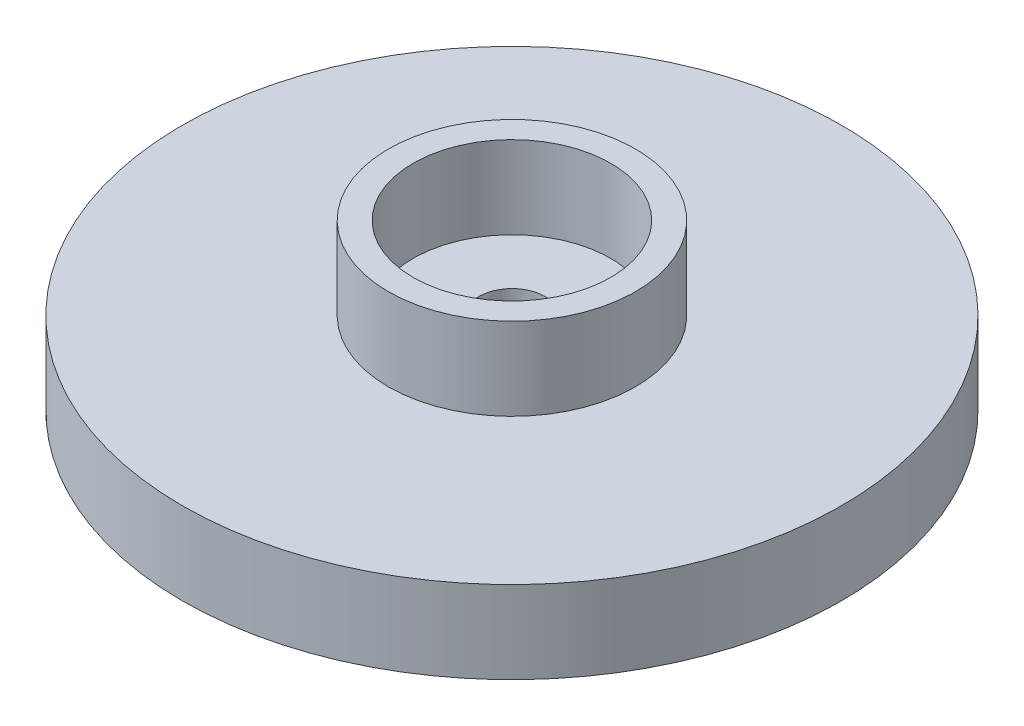
ISO-10303-21;
HEADER;
FILE_DESCRIPTION(('STEP AP214'),'2;1');
FILE_NAME('part.step','',(''),(''),'','','');
FILE_SCHEMA(('AUTOMOTIVE_DESIGN { 1 0 10303 214 1 1 1 1 }'));
ENDSEC;
DATA;
#1=APPLICATION_CONTEXT('core data for automotive mechanical design processes');
#2=APPLICATION_PROTOCOL_DEFINITION('international standard','automotive_design',2000,#1);
#3=PRODUCT_CONTEXT('',#1,'mechanical');
#4=PRODUCT('Part','Part','',(#3));
#5=PRODUCT_RELATED_PRODUCT_CATEGORY('part','',(#4));
#6=PRODUCT_DEFINITION_FORMATION('','',#4);
#7=PRODUCT_DEFINITION_CONTEXT('part definition',#1,'design');
#8=PRODUCT_DEFINITION('design','',#6,#7);
#9=PRODUCT_DEFINITION_SHAPE('','',#8);
#10=(LENGTH_UNIT() NAMED_UNIT(*) SI_UNIT(.MILLI.,.METRE.));
#11=(NAMED_UNIT(*) PLANE_ANGLE_UNIT() SI_UNIT($,.RADIAN.));
#12=(NAMED_UNIT(*) SI_UNIT($,.STERADIAN.) SOLID_ANGLE_UNIT());
#13=UNCERTAINTY_MEASURE_WITH_UNIT(LENGTH_MEASURE(1.E-05),#10,'distance_accuracy_value','');
#14=(GEOMETRIC_REPRESENTATION_CONTEXT(3) GLOBAL_UNCERTAINTY_ASSIGNED_CONTEXT((#13)) GLOBAL_UNIT_ASSIGNED_CONTEXT((#10,
#11,#12)) REPRESENTATION_CONTEXT('',''));
#15=CARTESIAN_POINT('',(0.,0.,0.));
#16=DIRECTION('',(0.,0.,1.));
#17=DIRECTION('',(1.,0.,0.));
#18=AXIS2_PLACEMENT_3D('',#15,#16,#17);
#19=CARTESIAN_POINT('',(0.,2.5,0.));
#20=DIRECTION('',(0.,-1.,0.));
#21=DIRECTION('',(0.,0.,-1.));
#22=AXIS2_PLACEMENT_3D('',#19,#20,#21);
#23=CYLINDRICAL_SURFACE('',#22,10.);
#24=CARTESIAN_POINT('',(0.,2.5,0.));
#25=DIRECTION('',(0.,1.,0.));
#26=DIRECTION('',(0.,0.,1.));
#27=AXIS2_PLACEMENT_3D('',#24,#25,#26);
#28=CIRCLE('',#27,10.);
#29=CARTESIAN_POINT('',(0.,2.5,10.));
#30=VERTEX_POINT('',#29);
#31=EDGE_CURVE('E50',#30,#30,#28,.T.);
#32=ORIENTED_EDGE('',*,*,#31,.F.);
#33=EDGE_LOOP('',(#32));
#34=FACE_BOUND('',#33,.T.);
#35=CARTESIAN_POINT('',(0.,0.,0.));
#36=DIRECTION('',(0.,1.,0.));
#37=DIRECTION('',(0.,0.,1.));
#38=AXIS2_PLACEMENT_3D('',#35,#36,#37);
#39=CIRCLE('',#38,10.);
#40=CARTESIAN_POINT('',(0.,0.,10.));
#41=VERTEX_POINT('',#40);
#42=EDGE_CURVE('E55',#41,#41,#39,.T.);
#43=ORIENTED_EDGE('',*,*,#42,.T.);
#44=EDGE_LOOP('',(#43));
#45=FACE_BOUND('',#44,.T.);
#46=ADVANCED_FACE('F43',(#34,#45),#23,.T.);
#47=CARTESIAN_POINT('',(0.,2.5,0.));
#48=DIRECTION('',(0.,1.,0.));
#49=DIRECTION('',(0.,0.,1.));
#50=AXIS2_PLACEMENT_3D('',#47,#48,#49);
#51=PLANE('',#50);
#52=CARTESIAN_POINT('',(0.,2.5,0.));
#53=DIRECTION('',(0.,1.,0.));
#54=DIRECTION('',(0.,0.,1.));
#55=AXIS2_PLACEMENT_3D('',#52,#53,#54);
#56=CIRCLE('',#55,3.75);
#57=CARTESIAN_POINT('',(0.,2.5,3.75));
#58=VERTEX_POINT('',#57);
#59=EDGE_CURVE('E63',#58,#58,#56,.T.);
#60=ORIENTED_EDGE('',*,*,#59,.F.);
#61=EDGE_LOOP('',(#60));
#62=FACE_BOUND('',#61,.T.);
#63=ORIENTED_EDGE('',*,*,#31,.T.);
#64=EDGE_LOOP('',(#63));
#65=FACE_BOUND('',#64,.T.);
#66=ADVANCED_FACE('F97',(#62,#65),#51,.T.);
#67=CARTESIAN_POINT('',(0.,0.,0.));
#68=DIRECTION('',(0.,1.,0.));
#69=DIRECTION('',(0.,0.,1.));
#70=AXIS2_PLACEMENT_3D('',#67,#68,#69);
#71=PLANE('',#70);
#72=CARTESIAN_POINT('',(0.,0.,0.));
#73=DIRECTION('',(0.,1.,0.));
#74=DIRECTION('',(0.,0.,1.));
#75=AXIS2_PLACEMENT_3D('',#72,#73,#74);
#76=CIRCLE('',#75,1.);
#77=CARTESIAN_POINT('',(0.,0.,1.));
#78=VERTEX_POINT('',#77);
#79=EDGE_CURVE('E68',#78,#78,#76,.T.);
#80=ORIENTED_EDGE('',*,*,#79,.T.);
#81=EDGE_LOOP('',(#80));
#82=FACE_BOUND('',#81,.T.);
#83=ORIENTED_EDGE('',*,*,#42,.F.);
#84=EDGE_LOOP('',(#83));
#85=FACE_BOUND('',#84,.T.);
#86=ADVANCED_FACE('F83',(#82,#85),#71,.F.);
#87=CARTESIAN_POINT('',(0.,5.,0.));
#88=DIRECTION('',(0.,-1.,0.));
#89=DIRECTION('',(0.,0.,-1.));
#90=AXIS2_PLACEMENT_3D('',#87,#88,#89);
#91=CYLINDRICAL_SURFACE('',#90,3.);
#92=CARTESIAN_POINT('',(0.,5.,0.));
#93=DIRECTION('',(0.,1.,0.));
#94=DIRECTION('',(0.,0.,1.));
#95=AXIS2_PLACEMENT_3D('',#92,#93,#94);
#96=CIRCLE('',#95,3.);
#97=CARTESIAN_POINT('',(0.,5.,3.));
#98=VERTEX_POINT('',#97);
#99=EDGE_CURVE('E67',#98,#98,#96,.T.);
#100=ORIENTED_EDGE('',*,*,#99,.T.);
#101=EDGE_LOOP('',(#100));
#102=FACE_BOUND('',#101,.T.);
#103=CARTESIAN_POINT('',(0.,2.5,0.));
#104=DIRECTION('',(0.,1.,0.));
#105=DIRECTION('',(0.,0.,1.));
#106=AXIS2_PLACEMENT_3D('',#103,#104,#105);
#107=CIRCLE('',#106,3.);
#108=CARTESIAN_POINT('',(0.,2.5,3.));
#109=VERTEX_POINT('',#108);
#110=EDGE_CURVE('E10',#109,#109,#107,.F.);
#111=ORIENTED_EDGE('',*,*,#110,.T.);
#112=EDGE_LOOP('',(#111));
#113=FACE_BOUND('',#112,.T.);
#114=ADVANCED_FACE('F114',(#102,#113),#91,.F.);
#115=CARTESIAN_POINT('',(0.,5.,0.));
#116=DIRECTION('',(0.,-1.,0.));
#117=DIRECTION('',(0.,0.,-1.));
#118=AXIS2_PLACEMENT_3D('',#115,#116,#117);
#119=CYLINDRICAL_SURFACE('',#118,3.75);
#120=CARTESIAN_POINT('',(0.,5.,0.));
#121=DIRECTION('',(0.,1.,0.));
#122=DIRECTION('',(0.,0.,1.));
#123=AXIS2_PLACEMENT_3D('',#120,#121,#122);
#124=CIRCLE('',#123,3.75);
#125=CARTESIAN_POINT('',(0.,5.,3.75));
#126=VERTEX_POINT('',#125);
#127=EDGE_CURVE('E61',#126,#126,#124,.T.);
#128=ORIENTED_EDGE('',*,*,#127,.F.);
#129=EDGE_LOOP('',(#128));
#130=FACE_BOUND('',#129,.T.);
#131=ORIENTED_EDGE('',*,*,#59,.T.);
#132=EDGE_LOOP('',(#131));
#133=FACE_BOUND('',#132,.T.);
#134=ADVANCED_FACE('F101',(#130,#133),#119,.T.);
#135=CARTESIAN_POINT('',(0.,5.,0.));
#136=DIRECTION('',(0.,1.,0.));
#137=DIRECTION('',(0.,0.,1.));
#138=AXIS2_PLACEMENT_3D('',#135,#136,#137);
#139=PLANE('',#138);
#140=ORIENTED_EDGE('',*,*,#99,.F.);
#141=EDGE_LOOP('',(#140));
#142=FACE_BOUND('',#141,.T.);
#143=ORIENTED_EDGE('',*,*,#127,.T.);
#144=EDGE_LOOP('',(#143));
#145=FACE_BOUND('',#144,.T.);
#146=ADVANCED_FACE('F95',(#142,#145),#139,.T.);
#147=CARTESIAN_POINT('',(0.,2.5,0.));
#148=DIRECTION('',(0.,1.,0.));
#149=DIRECTION('',(0.,0.,1.));
#150=AXIS2_PLACEMENT_3D('',#147,#148,#149);
#151=CIRCLE('',#150,1.);
#152=CARTESIAN_POINT('',(0.,2.5,1.));
#153=VERTEX_POINT('',#152);
#154=EDGE_CURVE('E75',#153,#153,#151,.T.);
#155=ORIENTED_EDGE('',*,*,#154,.F.);
#156=EDGE_LOOP('',(#155));
#157=FACE_BOUND('',#156,.T.);
#158=ORIENTED_EDGE('',*,*,#110,.F.);
#159=EDGE_LOOP('',(#158));
#160=FACE_BOUND('',#159,.T.);
#161=ADVANCED_FACE('F89',(#157,#160),#51,.T.);
#162=CARTESIAN_POINT('',(0.,0.,0.));
#163=DIRECTION('',(0.,1.,0.));
#164=DIRECTION('',(0.,0.,1.));
#165=AXIS2_PLACEMENT_3D('',#162,#163,#164);
#166=CYLINDRICAL_SURFACE('',#165,1.);
#167=ORIENTED_EDGE('',*,*,#79,.F.);
#168=EDGE_LOOP('',(#167));
#169=FACE_BOUND('',#168,.T.);
#170=ORIENTED_EDGE('',*,*,#154,.T.);
#171=EDGE_LOOP('',(#170));
#172=FACE_BOUND('',#171,.T.);
#173=ADVANCED_FACE('F86',(#169,#172),#166,.F.);
#174=CLOSED_SHELL('',(#46,#66,#86,#114,#134,#146,#161,#173));
#175=MANIFOLD_SOLID_BREP('B2',#174);
#176=ADVANCED_BREP_SHAPE_REPRESENTATION('',(#18,#175),#14);
#177=SHAPE_DEFINITION_REPRESENTATION(#9,#176);
ENDSEC;
END-ISO-10303-21;
